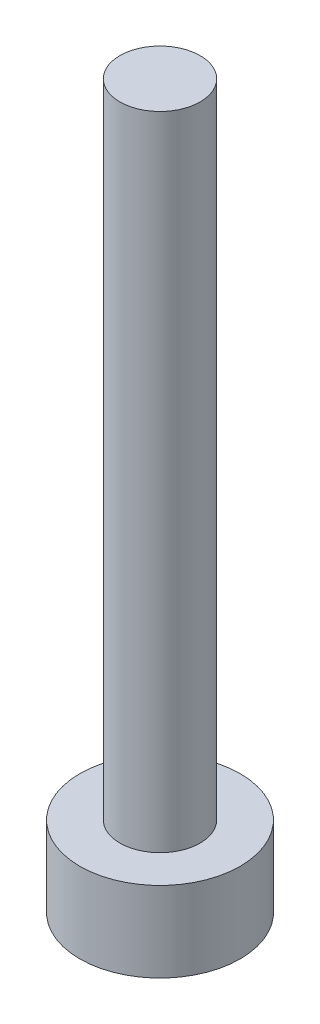
ISO-10303-21;
HEADER;
FILE_DESCRIPTION(('STEP AP214'),'2;1');
FILE_NAME('part.step','',(''),(''),'','','');
FILE_SCHEMA(('AUTOMOTIVE_DESIGN { 1 0 10303 214 1 1 1 1 }'));
ENDSEC;
DATA;
#1=APPLICATION_CONTEXT('core data for automotive mechanical design processes');
#2=APPLICATION_PROTOCOL_DEFINITION('international standard','automotive_design',2000,#1);
#3=PRODUCT_CONTEXT('',#1,'mechanical');
#4=PRODUCT('Part','Part','',(#3));
#5=PRODUCT_RELATED_PRODUCT_CATEGORY('part','',(#4));
#6=PRODUCT_DEFINITION_FORMATION('','',#4);
#7=PRODUCT_DEFINITION_CONTEXT('part definition',#1,'design');
#8=PRODUCT_DEFINITION('design','',#6,#7);
#9=PRODUCT_DEFINITION_SHAPE('','',#8);
#10=(LENGTH_UNIT() NAMED_UNIT(*) SI_UNIT(.MILLI.,.METRE.));
#11=(NAMED_UNIT(*) PLANE_ANGLE_UNIT() SI_UNIT($,.RADIAN.));
#12=(NAMED_UNIT(*) SI_UNIT($,.STERADIAN.) SOLID_ANGLE_UNIT());
#13=UNCERTAINTY_MEASURE_WITH_UNIT(LENGTH_MEASURE(1.E-05),#10,'distance_accuracy_value','');
#14=(GEOMETRIC_REPRESENTATION_CONTEXT(3) GLOBAL_UNCERTAINTY_ASSIGNED_CONTEXT((#13)) GLOBAL_UNIT_ASSIGNED_CONTEXT((#10,
#11,#12)) REPRESENTATION_CONTEXT('',''));
#15=CARTESIAN_POINT('',(0.,0.,0.));
#16=DIRECTION('',(0.,0.,1.));
#17=DIRECTION('',(1.,0.,0.));
#18=AXIS2_PLACEMENT_3D('',#15,#16,#17);
#19=CARTESIAN_POINT('',(0.,-2.,0.));
#20=DIRECTION('',(0.,1.,0.));
#21=DIRECTION('',(0.,0.,1.));
#22=AXIS2_PLACEMENT_3D('',#19,#20,#21);
#23=CYLINDRICAL_SURFACE('',#22,2.);
#24=CARTESIAN_POINT('',(0.,-2.,0.));
#25=DIRECTION('',(0.,1.,0.));
#26=DIRECTION('',(0.,0.,1.));
#27=AXIS2_PLACEMENT_3D('',#24,#25,#26);
#28=CIRCLE('',#27,2.);
#29=CARTESIAN_POINT('',(0.,-2.,2.));
#30=VERTEX_POINT('',#29);
#31=EDGE_CURVE('E10',#30,#30,#28,.T.);
#32=ORIENTED_EDGE('',*,*,#31,.T.);
#33=EDGE_LOOP('',(#32));
#34=FACE_BOUND('',#33,.T.);
#35=CARTESIAN_POINT('',(0.,0.,0.));
#36=DIRECTION('',(0.,1.,0.));
#37=DIRECTION('',(0.,0.,1.));
#38=AXIS2_PLACEMENT_3D('',#35,#36,#37);
#39=CIRCLE('',#38,2.);
#40=CARTESIAN_POINT('',(0.,0.,2.));
#41=VERTEX_POINT('',#40);
#42=EDGE_CURVE('E40',#41,#41,#39,.T.);
#43=ORIENTED_EDGE('',*,*,#42,.F.);
#44=EDGE_LOOP('',(#43));
#45=FACE_BOUND('',#44,.T.);
#46=ADVANCED_FACE('F37',(#34,#45),#23,.T.);
#47=CARTESIAN_POINT('',(0.,-2.,0.));
#48=DIRECTION('',(0.,1.,0.));
#49=DIRECTION('',(0.,0.,1.));
#50=AXIS2_PLACEMENT_3D('',#47,#48,#49);
#51=PLANE('',#50);
#52=ORIENTED_EDGE('',*,*,#31,.F.);
#53=EDGE_LOOP('',(#52));
#54=FACE_BOUND('',#53,.T.);
#55=ADVANCED_FACE('F66',(#54),#51,.F.);
#56=CARTESIAN_POINT('',(0.,0.,0.));
#57=DIRECTION('',(0.,1.,0.));
#58=DIRECTION('',(0.,0.,1.));
#59=AXIS2_PLACEMENT_3D('',#56,#57,#58);
#60=PLANE('',#59);
#61=CARTESIAN_POINT('',(0.,0.,0.));
#62=DIRECTION('',(0.,1.,0.));
#63=DIRECTION('',(0.,0.,1.));
#64=AXIS2_PLACEMENT_3D('',#61,#62,#63);
#65=CIRCLE('',#64,1.);
#66=CARTESIAN_POINT('',(0.,0.,1.));
#67=VERTEX_POINT('',#66);
#68=EDGE_CURVE('E49',#67,#67,#65,.T.);
#69=ORIENTED_EDGE('',*,*,#68,.F.);
#70=EDGE_LOOP('',(#69));
#71=FACE_BOUND('',#70,.T.);
#72=ORIENTED_EDGE('',*,*,#42,.T.);
#73=EDGE_LOOP('',(#72));
#74=FACE_BOUND('',#73,.T.);
#75=ADVANCED_FACE('F60',(#71,#74),#60,.T.);
#76=CARTESIAN_POINT('',(0.,16.,0.));
#77=DIRECTION('',(0.,-1.,0.));
#78=DIRECTION('',(0.,0.,-1.));
#79=AXIS2_PLACEMENT_3D('',#76,#77,#78);
#80=CYLINDRICAL_SURFACE('',#79,1.);
#81=CARTESIAN_POINT('',(0.,16.,0.));
#82=DIRECTION('',(0.,1.,0.));
#83=DIRECTION('',(0.,0.,1.));
#84=AXIS2_PLACEMENT_3D('',#81,#82,#83);
#85=CIRCLE('',#84,1.);
#86=CARTESIAN_POINT('',(0.,16.,1.));
#87=VERTEX_POINT('',#86);
#88=EDGE_CURVE('E47',#87,#87,#85,.T.);
#89=ORIENTED_EDGE('',*,*,#88,.F.);
#90=EDGE_LOOP('',(#89));
#91=FACE_BOUND('',#90,.T.);
#92=ORIENTED_EDGE('',*,*,#68,.T.);
#93=EDGE_LOOP('',(#92));
#94=FACE_BOUND('',#93,.T.);
#95=ADVANCED_FACE('F57',(#91,#94),#80,.T.);
#96=CARTESIAN_POINT('',(0.,16.,0.));
#97=DIRECTION('',(0.,1.,0.));
#98=DIRECTION('',(0.,0.,1.));
#99=AXIS2_PLACEMENT_3D('',#96,#97,#98);
#100=PLANE('',#99);
#101=ORIENTED_EDGE('',*,*,#88,.T.);
#102=EDGE_LOOP('',(#101));
#103=FACE_BOUND('',#102,.T.);
#104=ADVANCED_FACE('F55',(#103),#100,.T.);
#105=CLOSED_SHELL('',(#46,#55,#75,#95,#104));
#106=MANIFOLD_SOLID_BREP('B2',#105);
#107=ADVANCED_BREP_SHAPE_REPRESENTATION('',(#18,#106),#14);
#108=SHAPE_DEFINITION_REPRESENTATION(#9,#107);
ENDSEC;
END-ISO-10303-21;
